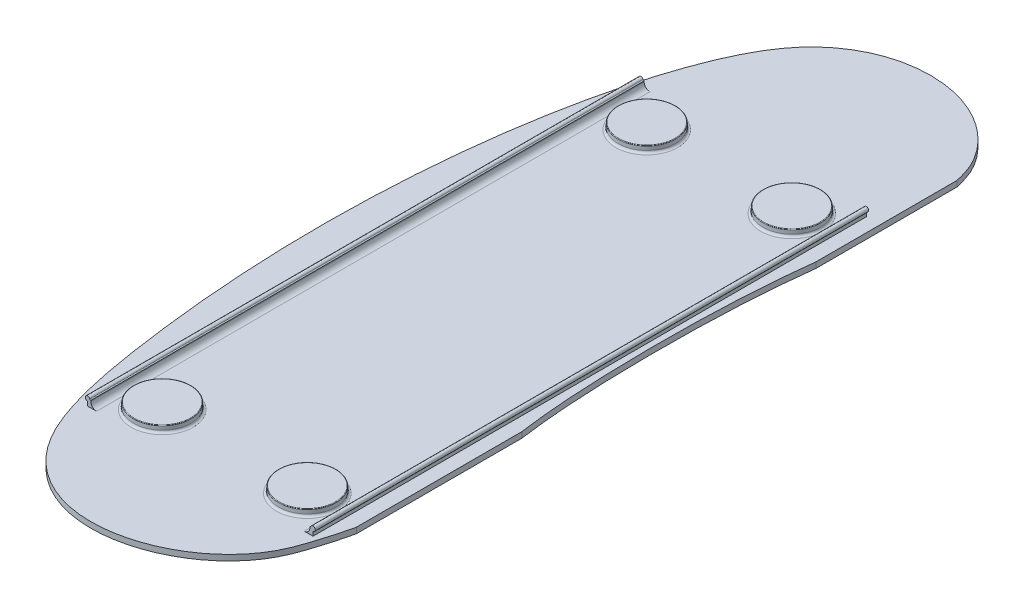
ISO-10303-21;
HEADER;
FILE_DESCRIPTION(('STEP AP214'),'2;1');
FILE_NAME('part.step','',(''),(''),'','','');
FILE_SCHEMA(('AUTOMOTIVE_DESIGN { 1 0 10303 214 1 1 1 1 }'));
ENDSEC;
DATA;
#1=APPLICATION_CONTEXT('core data for automotive mechanical design processes');
#2=APPLICATION_PROTOCOL_DEFINITION('international standard','automotive_design',2000,#1);
#3=PRODUCT_CONTEXT('',#1,'mechanical');
#4=PRODUCT('Part','Part','',(#3));
#5=PRODUCT_RELATED_PRODUCT_CATEGORY('part','',(#4));
#6=PRODUCT_DEFINITION_FORMATION('','',#4);
#7=PRODUCT_DEFINITION_CONTEXT('part definition',#1,'design');
#8=PRODUCT_DEFINITION('design','',#6,#7);
#9=PRODUCT_DEFINITION_SHAPE('','',#8);
#10=(LENGTH_UNIT() NAMED_UNIT(*) SI_UNIT(.MILLI.,.METRE.));
#11=(NAMED_UNIT(*) PLANE_ANGLE_UNIT() SI_UNIT($,.RADIAN.));
#12=(NAMED_UNIT(*) SI_UNIT($,.STERADIAN.) SOLID_ANGLE_UNIT());
#13=UNCERTAINTY_MEASURE_WITH_UNIT(LENGTH_MEASURE(1.E-05),#10,'distance_accuracy_value','');
#14=(GEOMETRIC_REPRESENTATION_CONTEXT(3) GLOBAL_UNCERTAINTY_ASSIGNED_CONTEXT((#13)) GLOBAL_UNIT_ASSIGNED_CONTEXT((#10,
#11,#12)) REPRESENTATION_CONTEXT('',''));
#15=CARTESIAN_POINT('',(0.,0.,0.));
#16=DIRECTION('',(0.,0.,1.));
#17=DIRECTION('',(1.,0.,0.));
#18=AXIS2_PLACEMENT_3D('',#15,#16,#17);
#19=CARTESIAN_POINT('',(-192.253506798672,1.15,-20.0821070412094));
#20=DIRECTION('',(1.,0.,0.));
#21=DIRECTION('',(0.,0.,-1.));
#22=AXIS2_PLACEMENT_3D('',#19,#20,#21);
#23=PLANE('',#22);
#24=DIRECTION('',(0.,-1.,0.));
#25=VECTOR('',#24,1.);
#26=CARTESIAN_POINT('',(-192.253506798672,1.15,76.4178929587906));
#27=LINE('',#26,#25);
#28=CARTESIAN_POINT('',(-192.253506798672,0.584314575050781,76.4178929587906));
#29=VERTEX_POINT('',#28);
#30=CARTESIAN_POINT('',(-192.253506798672,0.,76.4178929587906));
#31=VERTEX_POINT('',#30);
#32=EDGE_CURVE('E292',#29,#31,#27,.T.);
#33=ORIENTED_EDGE('',*,*,#32,.F.);
#34=DIRECTION('',(0.,0.,-1.));
#35=VECTOR('',#34,1.);
#36=CARTESIAN_POINT('',(-192.253506798672,0.584314575050781,-20.0821070412094));
#37=LINE('',#36,#35);
#38=CARTESIAN_POINT('',(-192.253506798672,0.584314575050781,-20.0821070412094));
#39=VERTEX_POINT('',#38);
#40=EDGE_CURVE('E435',#29,#39,#37,.T.);
#41=ORIENTED_EDGE('',*,*,#40,.T.);
#42=DIRECTION('',(0.,-1.,0.));
#43=VECTOR('',#42,1.);
#44=CARTESIAN_POINT('',(-192.253506798672,1.15,-20.0821070412094));
#45=LINE('',#44,#43);
#46=CARTESIAN_POINT('',(-192.253506798672,0.,-20.0821070412094));
#47=VERTEX_POINT('',#46);
#48=EDGE_CURVE('E294',#39,#47,#45,.T.);
#49=ORIENTED_EDGE('',*,*,#48,.T.);
#50=DIRECTION('',(0.,0.,1.));
#51=VECTOR('',#50,1.);
#52=CARTESIAN_POINT('',(-192.253506798672,0.,-20.0821070412094));
#53=LINE('',#52,#51);
#54=EDGE_CURVE('E279',#47,#31,#53,.T.);
#55=ORIENTED_EDGE('',*,*,#54,.T.);
#56=EDGE_LOOP('',(#33,#41,#49,#55));
#57=FACE_BOUND('',#56,.T.);
#58=ADVANCED_FACE('F117',(#57),#23,.F.);
#59=CARTESIAN_POINT('',(-152.953506798672,1.15,-20.0821070412094));
#60=DIRECTION('',(-1.,0.,0.));
#61=DIRECTION('',(0.,0.,1.));
#62=AXIS2_PLACEMENT_3D('',#59,#60,#61);
#63=PLANE('',#62);
#64=DIRECTION('',(0.,-1.,0.));
#65=VECTOR('',#64,1.);
#66=CARTESIAN_POINT('',(-152.953506798672,1.15,-20.0821070412094));
#67=LINE('',#66,#65);
#68=CARTESIAN_POINT('',(-152.953506798672,0.584314575050752,-20.0821070412094));
#69=VERTEX_POINT('',#68);
#70=CARTESIAN_POINT('',(-152.953506798672,0.,-20.0821070412094));
#71=VERTEX_POINT('',#70);
#72=EDGE_CURVE('E288',#69,#71,#67,.T.);
#73=ORIENTED_EDGE('',*,*,#72,.F.);
#74=DIRECTION('',(0.,0.,1.));
#75=VECTOR('',#74,1.);
#76=CARTESIAN_POINT('',(-152.953506798672,0.584314575050752,76.4178929587906));
#77=LINE('',#76,#75);
#78=CARTESIAN_POINT('',(-152.953506798672,0.584314575050752,76.4178929587906));
#79=VERTEX_POINT('',#78);
#80=EDGE_CURVE('E428',#69,#79,#77,.T.);
#81=ORIENTED_EDGE('',*,*,#80,.T.);
#82=DIRECTION('',(0.,-1.,0.));
#83=VECTOR('',#82,1.);
#84=CARTESIAN_POINT('',(-152.953506798672,1.15,76.4178929587906));
#85=LINE('',#84,#83);
#86=CARTESIAN_POINT('',(-152.953506798672,0.,76.4178929587906));
#87=VERTEX_POINT('',#86);
#88=EDGE_CURVE('E290',#79,#87,#85,.T.);
#89=ORIENTED_EDGE('',*,*,#88,.T.);
#90=DIRECTION('',(0.,0.,-1.));
#91=VECTOR('',#90,1.);
#92=CARTESIAN_POINT('',(-152.953506798672,0.,-20.0821070412094));
#93=LINE('',#92,#91);
#94=EDGE_CURVE('E285',#87,#71,#93,.T.);
#95=ORIENTED_EDGE('',*,*,#94,.T.);
#96=EDGE_LOOP('',(#73,#81,#89,#95));
#97=FACE_BOUND('',#96,.T.);
#98=ADVANCED_FACE('F386',(#97),#63,.F.);
#99=CARTESIAN_POINT('',(-152.953506798672,1.15,-20.0821070412094));
#100=DIRECTION('',(0.,0.,1.));
#101=DIRECTION('',(1.,0.,0.));
#102=AXIS2_PLACEMENT_3D('',#99,#100,#101);
#103=PLANE('',#102);
#104=DIRECTION('',(-1.,0.,0.));
#105=VECTOR('',#104,1.);
#106=CARTESIAN_POINT('',(-152.953506798672,0.,-20.0821070412094));
#107=LINE('',#106,#105);
#108=CARTESIAN_POINT('',(-154.503506798672,0.,-20.0821070412094));
#109=VERTEX_POINT('',#108);
#110=EDGE_CURVE('E277',#71,#109,#107,.T.);
#111=ORIENTED_EDGE('',*,*,#110,.T.);
#112=CARTESIAN_POINT('',(-154.503506798672,1.,-20.0821070412094));
#113=DIRECTION('',(0.,0.,1.));
#114=DIRECTION('',(1.,0.,0.));
#115=AXIS2_PLACEMENT_3D('',#112,#113,#114);
#116=CIRCLE('',#115,1.);
#117=CARTESIAN_POINT('',(-153.503506798672,1.,-20.0821070412094));
#118=VERTEX_POINT('',#117);
#119=EDGE_CURVE('E511',#109,#118,#116,.T.);
#120=ORIENTED_EDGE('',*,*,#119,.T.);
#121=DIRECTION('',(0.,1.,0.));
#122=VECTOR('',#121,1.);
#123=CARTESIAN_POINT('',(-153.503506798672,-103.785789007937,-20.0821070412094));
#124=LINE('',#123,#122);
#125=CARTESIAN_POINT('',(-153.503506798672,1.15,-20.0821070412094));
#126=VERTEX_POINT('',#125);
#127=EDGE_CURVE('E271',#118,#126,#124,.T.);
#128=ORIENTED_EDGE('',*,*,#127,.T.);
#129=CARTESIAN_POINT('',(-153.519415889582,1.349366247962,-20.0821070412094));
#130=DIRECTION('',(0.,0.,1.));
#131=DIRECTION('',(1.,0.,0.));
#132=AXIS2_PLACEMENT_3D('',#129,#130,#131);
#133=CIRCLE('',#132,0.2);
#134=CARTESIAN_POINT('',(-153.330779525945,1.28291083197464,-20.0821070412094));
#135=VERTEX_POINT('',#134);
#136=EDGE_CURVE('E441',#126,#135,#133,.T.);
#137=ORIENTED_EDGE('',*,*,#136,.T.);
#138=CARTESIAN_POINT('',(-152.953506798672,1.15,-20.0821070412094));
#139=DIRECTION('',(0.,0.,-1.));
#140=DIRECTION('',(-1.,0.,0.));
#141=AXIS2_PLACEMENT_3D('',#138,#139,#140);
#142=CIRCLE('',#141,0.400000000000011);
#143=CARTESIAN_POINT('',(-152.820173465339,0.772876383367158,-20.0821070412094));
#144=VERTEX_POINT('',#143);
#145=EDGE_CURVE('E262',#135,#144,#142,.T.);
#146=ORIENTED_EDGE('',*,*,#145,.T.);
#147=CARTESIAN_POINT('',(-152.753506798672,0.584314575050752,-20.0821070412094));
#148=DIRECTION('',(0.,0.,1.));
#149=DIRECTION('',(1.,0.,0.));
#150=AXIS2_PLACEMENT_3D('',#147,#148,#149);
#151=CIRCLE('',#150,0.2);
#152=EDGE_CURVE('E437',#144,#69,#151,.T.);
#153=ORIENTED_EDGE('',*,*,#152,.T.);
#154=ORIENTED_EDGE('',*,*,#72,.T.);
#155=EDGE_LOOP('',(#111,#120,#128,#137,#146,#153,#154));
#156=FACE_BOUND('',#155,.T.);
#157=ADVANCED_FACE('F393',(#156),#103,.F.);
#158=CARTESIAN_POINT('',(-192.253506798672,1.15,76.4178929587906));
#159=DIRECTION('',(0.,0.,-1.));
#160=DIRECTION('',(-1.,0.,0.));
#161=AXIS2_PLACEMENT_3D('',#158,#159,#160);
#162=PLANE('',#161);
#163=CARTESIAN_POINT('',(-152.953506798672,1.15,76.4178929587906));
#164=DIRECTION('',(0.,0.,-1.));
#165=DIRECTION('',(-1.,0.,0.));
#166=AXIS2_PLACEMENT_3D('',#163,#164,#165);
#167=CIRCLE('',#166,0.400000000000011);
#168=CARTESIAN_POINT('',(-153.330779525945,1.28291083197465,76.4178929587906));
#169=VERTEX_POINT('',#168);
#170=CARTESIAN_POINT('',(-152.820173465339,0.772876383367167,76.4178929587906));
#171=VERTEX_POINT('',#170);
#172=EDGE_CURVE('E267',#169,#171,#167,.T.);
#173=ORIENTED_EDGE('',*,*,#172,.F.);
#174=CARTESIAN_POINT('',(-153.519415889582,1.349366247962,76.4178929587906));
#175=DIRECTION('',(0.,0.,-1.));
#176=DIRECTION('',(-1.,0.,0.));
#177=AXIS2_PLACEMENT_3D('',#174,#175,#176);
#178=CIRCLE('',#177,0.2);
#179=CARTESIAN_POINT('',(-153.503506798672,1.15,76.4178929587906));
#180=VERTEX_POINT('',#179);
#181=EDGE_CURVE('E443',#169,#180,#178,.T.);
#182=ORIENTED_EDGE('',*,*,#181,.T.);
#183=DIRECTION('',(0.,1.,0.));
#184=VECTOR('',#183,1.);
#185=CARTESIAN_POINT('',(-153.503506798672,-103.785789007937,76.4178929587906));
#186=LINE('',#185,#184);
#187=CARTESIAN_POINT('',(-153.503506798672,1.,76.4178929587906));
#188=VERTEX_POINT('',#187);
#189=EDGE_CURVE('E274',#188,#180,#186,.T.);
#190=ORIENTED_EDGE('',*,*,#189,.F.);
#191=CARTESIAN_POINT('',(-154.503506798672,1.,76.4178929587906));
#192=DIRECTION('',(0.,0.,-1.));
#193=DIRECTION('',(-1.,0.,0.));
#194=AXIS2_PLACEMENT_3D('',#191,#192,#193);
#195=CIRCLE('',#194,1.);
#196=CARTESIAN_POINT('',(-154.503506798672,0.,76.4178929587906));
#197=VERTEX_POINT('',#196);
#198=EDGE_CURVE('E508',#188,#197,#195,.T.);
#199=ORIENTED_EDGE('',*,*,#198,.T.);
#200=DIRECTION('',(1.,0.,0.));
#201=VECTOR('',#200,1.);
#202=CARTESIAN_POINT('',(-192.253506798672,0.,76.4178929587906));
#203=LINE('',#202,#201);
#204=EDGE_CURVE('E282',#197,#87,#203,.T.);
#205=ORIENTED_EDGE('',*,*,#204,.T.);
#206=ORIENTED_EDGE('',*,*,#88,.F.);
#207=CARTESIAN_POINT('',(-152.753506798672,0.584314575050752,76.4178929587906));
#208=DIRECTION('',(0.,0.,-1.));
#209=DIRECTION('',(-1.,0.,0.));
#210=AXIS2_PLACEMENT_3D('',#207,#208,#209);
#211=CIRCLE('',#210,0.2);
#212=EDGE_CURVE('E439',#79,#171,#211,.T.);
#213=ORIENTED_EDGE('',*,*,#212,.T.);
#214=EDGE_LOOP('',(#173,#182,#190,#199,#205,#206,#213));
#215=FACE_BOUND('',#214,.T.);
#216=ADVANCED_FACE('F525',(#215),#162,.F.);
#217=CARTESIAN_POINT('',(0.,0.,0.));
#218=DIRECTION('',(0.,-1.,0.));
#219=DIRECTION('',(0.,0.,-1.));
#220=AXIS2_PLACEMENT_3D('',#217,#218,#219);
#221=PLANE('',#220);
#222=CARTESIAN_POINT('',(-185.253506798672,0.,70.4178929587906));
#223=DIRECTION('',(0.,-1.,0.));
#224=DIRECTION('',(0.,0.,-1.));
#225=AXIS2_PLACEMENT_3D('',#222,#223,#224);
#226=CIRCLE('',#225,5.39999999999999);
#227=CARTESIAN_POINT('',(-185.253506798672,0.,65.0178929587907));
#228=VERTEX_POINT('',#227);
#229=EDGE_CURVE('E483',#228,#228,#226,.T.);
#230=ORIENTED_EDGE('',*,*,#229,.T.);
#231=EDGE_LOOP('',(#230));
#232=FACE_BOUND('',#231,.T.);
#233=CARTESIAN_POINT('',(-159.953506798672,0.,70.4178929587906));
#234=DIRECTION('',(0.,-1.,0.));
#235=DIRECTION('',(0.,0.,-1.));
#236=AXIS2_PLACEMENT_3D('',#233,#234,#235);
#237=CIRCLE('',#236,5.39999999999999);
#238=CARTESIAN_POINT('',(-159.953506798672,0.,65.0178929587906));
#239=VERTEX_POINT('',#238);
#240=EDGE_CURVE('E480',#239,#239,#237,.T.);
#241=ORIENTED_EDGE('',*,*,#240,.T.);
#242=EDGE_LOOP('',(#241));
#243=FACE_BOUND('',#242,.T.);
#244=CARTESIAN_POINT('',(-185.253506798672,0.,-14.0821070412094));
#245=DIRECTION('',(0.,-1.,0.));
#246=DIRECTION('',(0.,0.,-1.));
#247=AXIS2_PLACEMENT_3D('',#244,#245,#246);
#248=CIRCLE('',#247,5.39999999999999);
#249=CARTESIAN_POINT('',(-185.253506798672,0.,-19.4821070412094));
#250=VERTEX_POINT('',#249);
#251=EDGE_CURVE('E477',#250,#250,#248,.T.);
#252=ORIENTED_EDGE('',*,*,#251,.T.);
#253=EDGE_LOOP('',(#252));
#254=FACE_BOUND('',#253,.T.);
#255=CARTESIAN_POINT('',(-159.953506798672,0.,-14.0821070412094));
#256=DIRECTION('',(0.,-1.,0.));
#257=DIRECTION('',(0.,0.,-1.));
#258=AXIS2_PLACEMENT_3D('',#255,#256,#257);
#259=CIRCLE('',#258,5.39999999999999);
#260=CARTESIAN_POINT('',(-159.953506798672,0.,-19.4821070412094));
#261=VERTEX_POINT('',#260);
#262=EDGE_CURVE('E474',#261,#261,#259,.T.);
#263=ORIENTED_EDGE('',*,*,#262,.T.);
#264=EDGE_LOOP('',(#263));
#265=FACE_BOUND('',#264,.T.);
#266=DIRECTION('',(0.,0.,1.));
#267=VECTOR('',#266,1.);
#268=CARTESIAN_POINT('',(-190.703506798672,0.,76.4178929587906));
#269=LINE('',#268,#267);
#270=CARTESIAN_POINT('',(-190.703506798672,0.,-20.0821070412094));
#271=VERTEX_POINT('',#270);
#272=CARTESIAN_POINT('',(-190.703506798672,0.,76.4178929587906));
#273=VERTEX_POINT('',#272);
#274=EDGE_CURVE('E501',#271,#273,#269,.T.);
#275=ORIENTED_EDGE('',*,*,#274,.T.);
#276=EDGE_CURVE('E283',#31,#273,#203,.T.);
#277=ORIENTED_EDGE('',*,*,#276,.F.);
#278=ORIENTED_EDGE('',*,*,#54,.F.);
#279=EDGE_CURVE('E273',#271,#47,#107,.T.);
#280=ORIENTED_EDGE('',*,*,#279,.F.);
#281=EDGE_LOOP('',(#275,#277,#278,#280));
#282=FACE_BOUND('',#281,.T.);
#283=DIRECTION('',(0.,0.,1.));
#284=VECTOR('',#283,1.);
#285=CARTESIAN_POINT('',(-150.543506798672,0.,0.));
#286=LINE('',#285,#284);
#287=CARTESIAN_POINT('',(-150.543506798672,0.,42.4221344366589));
#288=VERTEX_POINT('',#287);
#289=CARTESIAN_POINT('',(-150.543506798672,0.,71.2812308740238));
#290=VERTEX_POINT('',#289);
#291=EDGE_CURVE('E296',#288,#290,#286,.T.);
#292=ORIENTED_EDGE('',*,*,#291,.F.);
#293=CARTESIAN_POINT('',(-150.543506798672,0.,42.4221344366589));
#294=CARTESIAN_POINT('',(-149.87356577608,0.,48.1140128894975));
#295=CARTESIAN_POINT('',(-148.278546710452,0.,63.9626210010931));
#296=CARTESIAN_POINT('',(-151.853536774706,0.,76.2414544995898));
#297=CARTESIAN_POINT('',(-157.159821335867,0.,93.1301695319022));
#298=CARTESIAN_POINT('',(-189.449961988125,0.,102.027699126461));
#299=CARTESIAN_POINT('',(-203.492044916193,0.,30.0657144599285));
#300=CARTESIAN_POINT('',(-196.078968692878,0.,-21.8132718738506));
#301=CARTESIAN_POINT('',(-179.12954818703,0.,-49.342726570093));
#302=CARTESIAN_POINT('',(-159.828165808346,0.,-48.9223362720737));
#303=CARTESIAN_POINT('',(-151.707122140152,0.,-37.5608181876024));
#304=CARTESIAN_POINT('',(-150.628141150404,0.,-34.0922077096906));
#305=CARTESIAN_POINT('',(-149.005776309877,0.,-25.5043753827882));
#306=CARTESIAN_POINT('',(-149.753495962378,0.,-15.3590020513309));
#307=CARTESIAN_POINT('',(-152.504186571276,0.,7.27371901696906));
#308=CARTESIAN_POINT('',(-151.994040872551,0.,31.6859631096172));
#309=CARTESIAN_POINT('',(-150.744518549863,0.,40.7143207384556));
#310=CARTESIAN_POINT('',(-150.543506798672,0.,42.4221344366589));
#311=B_SPLINE_CURVE_WITH_KNOTS('',3,(#293,#294,#295,#296,#297,#298,#299,#300,#301,#302,#303,
#304,#305,#306,#307,#308,#309,#310),.UNSPECIFIED.,.T.,.F.,(4,1,1,1,1,1,1,1,1,1,1,1,1,1,1,4),(0.,
0.077011586370835,0.0902811537206076,0.105290010403906,0.213565692892721,0.249846177996582,
0.43181437633865,0.473017713532991,0.620676212745646,0.641064732595728,0.656514392183728,
0.669494179040439,0.757882814306125,0.792038254342903,0.976893139371433,0.999999999999999),.UNSPECIFIED.);
#312=CARTESIAN_POINT('',(-150.543506798672,0.,-8.92432629280241));
#313=VERTEX_POINT('',#312);
#314=EDGE_CURVE('E301',#313,#288,#311,.T.);
#315=ORIENTED_EDGE('',*,*,#314,.F.);
#316=DIRECTION('',(0.,0.,-1.));
#317=VECTOR('',#316,1.);
#318=CARTESIAN_POINT('',(-150.543506798672,0.,0.));
#319=LINE('',#318,#317);
#320=CARTESIAN_POINT('',(-150.543506798672,0.,-33.4757120400574));
#321=VERTEX_POINT('',#320);
#322=EDGE_CURVE('E559',#313,#321,#319,.T.);
#323=ORIENTED_EDGE('',*,*,#322,.T.);
#324=EDGE_CURVE('E558',#290,#321,#311,.T.);
#325=ORIENTED_EDGE('',*,*,#324,.F.);
#326=EDGE_LOOP('',(#292,#315,#323,#325));
#327=FACE_BOUND('',#326,.T.);
#328=ORIENTED_EDGE('',*,*,#204,.F.);
#329=DIRECTION('',(0.,0.,1.));
#330=VECTOR('',#329,1.);
#331=CARTESIAN_POINT('',(-154.503506798672,0.,0.));
#332=LINE('',#331,#330);
#333=EDGE_CURVE('E504',#197,#109,#332,.F.);
#334=ORIENTED_EDGE('',*,*,#333,.T.);
#335=ORIENTED_EDGE('',*,*,#110,.F.);
#336=ORIENTED_EDGE('',*,*,#94,.F.);
#337=EDGE_LOOP('',(#328,#334,#335,#336));
#338=FACE_BOUND('',#337,.T.);
#339=ADVANCED_FACE('F321',(#232,#243,#254,#265,#282,#327,#338),#221,.F.);
#340=CARTESIAN_POINT('',(-150.543506798672,-1.,0.));
#341=DIRECTION('',(-1.,0.,0.));
#342=DIRECTION('',(0.,0.,1.));
#343=AXIS2_PLACEMENT_3D('',#340,#341,#342);
#344=PLANE('',#343);
#345=ORIENTED_EDGE('',*,*,#291,.T.);
#346=DIRECTION('',(0.,1.,0.));
#347=VECTOR('',#346,1.);
#348=CARTESIAN_POINT('',(-150.543506798672,-1.,71.2812308740238));
#349=LINE('',#348,#347);
#350=CARTESIAN_POINT('',(-150.543506798672,-1.,71.2812308740238));
#351=VERTEX_POINT('',#350);
#352=EDGE_CURVE('E413',#351,#290,#349,.T.);
#353=ORIENTED_EDGE('',*,*,#352,.F.);
#354=DIRECTION('',(0.,0.,1.));
#355=VECTOR('',#354,1.);
#356=CARTESIAN_POINT('',(-150.543506798672,-1.,0.));
#357=LINE('',#356,#355);
#358=CARTESIAN_POINT('',(-150.543506798672,-1.,42.4221344366589));
#359=VERTEX_POINT('',#358);
#360=EDGE_CURVE('E297',#359,#351,#357,.T.);
#361=ORIENTED_EDGE('',*,*,#360,.F.);
#362=DIRECTION('',(0.,1.,0.));
#363=VECTOR('',#362,1.);
#364=CARTESIAN_POINT('',(-150.543506798672,-1.,42.4221344366589));
#365=LINE('',#364,#363);
#366=EDGE_CURVE('E568',#359,#288,#365,.T.);
#367=ORIENTED_EDGE('',*,*,#366,.T.);
#368=EDGE_LOOP('',(#345,#353,#361,#367));
#369=FACE_BOUND('',#368,.T.);
#370=ADVANCED_FACE('F326',(#369),#344,.F.);
#371=CARTESIAN_POINT('',(-150.543506798672,-1.,42.4221344366589));
#372=CARTESIAN_POINT('',(-149.87356577608,-1.,48.1140128894975));
#373=CARTESIAN_POINT('',(-148.278546710452,-1.,63.9626210010931));
#374=CARTESIAN_POINT('',(-151.853536774706,-1.,76.2414544995898));
#375=CARTESIAN_POINT('',(-157.159821335867,-1.,93.1301695319022));
#376=CARTESIAN_POINT('',(-189.449961988125,-1.,102.027699126461));
#377=CARTESIAN_POINT('',(-203.492044916193,-1.,30.0657144599285));
#378=CARTESIAN_POINT('',(-196.078968692878,-1.,-21.8132718738506));
#379=CARTESIAN_POINT('',(-179.12954818703,-1.,-49.342726570093));
#380=CARTESIAN_POINT('',(-159.828165808346,-1.,-48.9223362720737));
#381=CARTESIAN_POINT('',(-151.707122140152,-1.,-37.5608181876024));
#382=CARTESIAN_POINT('',(-150.628141150404,-1.,-34.0922077096906));
#383=CARTESIAN_POINT('',(-149.005776309877,-1.,-25.5043753827882));
#384=CARTESIAN_POINT('',(-149.753495962378,-1.,-15.3590020513309));
#385=CARTESIAN_POINT('',(-152.504186571276,-1.,7.27371901696906));
#386=CARTESIAN_POINT('',(-151.994040872551,-1.,31.6859631096172));
#387=CARTESIAN_POINT('',(-150.744518549863,-1.,40.7143207384556));
#388=CARTESIAN_POINT('',(-150.543506798672,-1.,42.4221344366589));
#389=B_SPLINE_CURVE_WITH_KNOTS('',3,(#371,#372,#373,#374,#375,#376,#377,#378,#379,#380,#381,
#382,#383,#384,#385,#386,#387,#388),.UNSPECIFIED.,.T.,.F.,(4,1,1,1,1,1,1,1,1,1,1,1,1,1,1,4),(0.,
0.077011586370835,0.0902811537206076,0.105290010403906,0.213565692892721,0.249846177996582,
0.43181437633865,0.473017713532991,0.620676212745646,0.641064732595728,0.656514392183728,
0.669494179040439,0.757882814306125,0.792038254342903,0.976893139371433,0.999999999999999),.UNSPECIFIED.);
#390=DIRECTION('',(0.,1.,0.));
#391=VECTOR('',#390,1.);
#392=SURFACE_OF_LINEAR_EXTRUSION('',#389,#391);
#393=ORIENTED_EDGE('',*,*,#324,.T.);
#394=DIRECTION('',(0.,1.,0.));
#395=VECTOR('',#394,1.);
#396=CARTESIAN_POINT('',(-150.543506798672,-1.,-33.4757120400574));
#397=LINE('',#396,#395);
#398=CARTESIAN_POINT('',(-150.543506798672,-1.,-33.4757120400574));
#399=VERTEX_POINT('',#398);
#400=EDGE_CURVE('E418',#399,#321,#397,.T.);
#401=ORIENTED_EDGE('',*,*,#400,.F.);
#402=EDGE_CURVE('E300',#351,#399,#389,.T.);
#403=ORIENTED_EDGE('',*,*,#402,.F.);
#404=ORIENTED_EDGE('',*,*,#352,.T.);
#405=EDGE_LOOP('',(#393,#401,#403,#404));
#406=FACE_BOUND('',#405,.T.);
#407=ADVANCED_FACE('F320',(#406),#392,.F.);
#408=CARTESIAN_POINT('',(-150.543506798672,-1.,0.));
#409=DIRECTION('',(1.,0.,0.));
#410=DIRECTION('',(0.,0.,-1.));
#411=AXIS2_PLACEMENT_3D('',#408,#409,#410);
#412=PLANE('',#411);
#413=ORIENTED_EDGE('',*,*,#322,.F.);
#414=DIRECTION('',(0.,1.,0.));
#415=VECTOR('',#414,1.);
#416=CARTESIAN_POINT('',(-150.543506798672,-1.,-8.92432629280241));
#417=LINE('',#416,#415);
#418=CARTESIAN_POINT('',(-150.543506798672,-1.,-8.92432629280241));
#419=VERTEX_POINT('',#418);
#420=EDGE_CURVE('E422',#419,#313,#417,.T.);
#421=ORIENTED_EDGE('',*,*,#420,.F.);
#422=DIRECTION('',(0.,0.,-1.));
#423=VECTOR('',#422,1.);
#424=CARTESIAN_POINT('',(-150.543506798672,-1.,0.));
#425=LINE('',#424,#423);
#426=EDGE_CURVE('E306',#419,#399,#425,.T.);
#427=ORIENTED_EDGE('',*,*,#426,.T.);
#428=ORIENTED_EDGE('',*,*,#400,.T.);
#429=EDGE_LOOP('',(#413,#421,#427,#428));
#430=FACE_BOUND('',#429,.T.);
#431=ADVANCED_FACE('F318',(#430),#412,.T.);
#432=ORIENTED_EDGE('',*,*,#314,.T.);
#433=ORIENTED_EDGE('',*,*,#366,.F.);
#434=EDGE_CURVE('E307',#419,#359,#389,.T.);
#435=ORIENTED_EDGE('',*,*,#434,.F.);
#436=ORIENTED_EDGE('',*,*,#420,.T.);
#437=EDGE_LOOP('',(#432,#433,#435,#436));
#438=FACE_BOUND('',#437,.T.);
#439=ADVANCED_FACE('F313',(#438),#392,.F.);
#440=CARTESIAN_POINT('',(0.,-1.,0.));
#441=DIRECTION('',(0.,-1.,0.));
#442=DIRECTION('',(0.,0.,-1.));
#443=AXIS2_PLACEMENT_3D('',#440,#441,#442);
#444=PLANE('',#443);
#445=ORIENTED_EDGE('',*,*,#360,.T.);
#446=ORIENTED_EDGE('',*,*,#402,.T.);
#447=ORIENTED_EDGE('',*,*,#426,.F.);
#448=ORIENTED_EDGE('',*,*,#434,.T.);
#449=EDGE_LOOP('',(#445,#446,#447,#448));
#450=FACE_BOUND('',#449,.T.);
#451=ADVANCED_FACE('F317',(#450),#444,.T.);
#452=CARTESIAN_POINT('',(-192.253506798672,1.15,-20.0821070412094));
#453=DIRECTION('',(0.,0.,1.));
#454=DIRECTION('',(1.,0.,0.));
#455=AXIS2_PLACEMENT_3D('',#452,#453,#454);
#456=CIRCLE('',#455,0.399999999999984);
#457=CARTESIAN_POINT('',(-191.8762340714,1.28291083197468,-20.0821070412094));
#458=VERTEX_POINT('',#457);
#459=CARTESIAN_POINT('',(-192.386840132006,0.772876383367197,-20.0821070412094));
#460=VERTEX_POINT('',#459);
#461=EDGE_CURVE('E254',#458,#460,#456,.T.);
#462=ORIENTED_EDGE('',*,*,#461,.F.);
#463=CARTESIAN_POINT('',(-191.687597707763,1.349366247962,-20.0821070412094));
#464=DIRECTION('',(0.,0.,1.));
#465=DIRECTION('',(1.,0.,0.));
#466=AXIS2_PLACEMENT_3D('',#463,#464,#465);
#467=CIRCLE('',#466,0.2);
#468=CARTESIAN_POINT('',(-191.703506798672,1.15,-20.0821070412094));
#469=VERTEX_POINT('',#468);
#470=EDGE_CURVE('E251',#458,#469,#467,.T.);
#471=ORIENTED_EDGE('',*,*,#470,.T.);
#472=DIRECTION('',(0.,1.,0.));
#473=VECTOR('',#472,1.);
#474=CARTESIAN_POINT('',(-191.703506798672,-103.785789007937,-20.0821070412094));
#475=LINE('',#474,#473);
#476=CARTESIAN_POINT('',(-191.703506798672,1.,-20.0821070412094));
#477=VERTEX_POINT('',#476);
#478=EDGE_CURVE('E239',#477,#469,#475,.T.);
#479=ORIENTED_EDGE('',*,*,#478,.F.);
#480=CARTESIAN_POINT('',(-190.703506798672,1.,-20.0821070412094));
#481=DIRECTION('',(0.,0.,1.));
#482=DIRECTION('',(1.,0.,0.));
#483=AXIS2_PLACEMENT_3D('',#480,#481,#482);
#484=CIRCLE('',#483,1.);
#485=EDGE_CURVE('E12',#477,#271,#484,.T.);
#486=ORIENTED_EDGE('',*,*,#485,.T.);
#487=ORIENTED_EDGE('',*,*,#279,.T.);
#488=ORIENTED_EDGE('',*,*,#48,.F.);
#489=CARTESIAN_POINT('',(-192.453506798672,0.584314575050781,-20.0821070412094));
#490=DIRECTION('',(0.,0.,1.));
#491=DIRECTION('',(1.,0.,0.));
#492=AXIS2_PLACEMENT_3D('',#489,#490,#491);
#493=CIRCLE('',#492,0.2);
#494=EDGE_CURVE('E448',#39,#460,#493,.T.);
#495=ORIENTED_EDGE('',*,*,#494,.T.);
#496=EDGE_LOOP('',(#462,#471,#479,#486,#487,#488,#495));
#497=FACE_BOUND('',#496,.T.);
#498=ADVANCED_FACE('F252',(#497),#103,.F.);
#499=ORIENTED_EDGE('',*,*,#276,.T.);
#500=CARTESIAN_POINT('',(-190.703506798672,1.,76.4178929587906));
#501=DIRECTION('',(0.,0.,-1.));
#502=DIRECTION('',(-1.,0.,0.));
#503=AXIS2_PLACEMENT_3D('',#500,#501,#502);
#504=CIRCLE('',#503,1.);
#505=CARTESIAN_POINT('',(-191.703506798672,1.,76.4178929587906));
#506=VERTEX_POINT('',#505);
#507=EDGE_CURVE('E125',#273,#506,#504,.T.);
#508=ORIENTED_EDGE('',*,*,#507,.T.);
#509=DIRECTION('',(0.,1.,0.));
#510=VECTOR('',#509,1.);
#511=CARTESIAN_POINT('',(-191.703506798672,-103.785789007937,76.4178929587906));
#512=LINE('',#511,#510);
#513=CARTESIAN_POINT('',(-191.703506798672,1.15,76.4178929587906));
#514=VERTEX_POINT('',#513);
#515=EDGE_CURVE('E246',#506,#514,#512,.T.);
#516=ORIENTED_EDGE('',*,*,#515,.T.);
#517=CARTESIAN_POINT('',(-191.687597707763,1.349366247962,76.4178929587906));
#518=DIRECTION('',(0.,0.,-1.));
#519=DIRECTION('',(-1.,0.,0.));
#520=AXIS2_PLACEMENT_3D('',#517,#518,#519);
#521=CIRCLE('',#520,0.2);
#522=CARTESIAN_POINT('',(-191.8762340714,1.28291083197468,76.4178929587906));
#523=VERTEX_POINT('',#522);
#524=EDGE_CURVE('E258',#514,#523,#521,.T.);
#525=ORIENTED_EDGE('',*,*,#524,.T.);
#526=CARTESIAN_POINT('',(-192.253506798672,1.15,76.4178929587906));
#527=DIRECTION('',(0.,0.,1.));
#528=DIRECTION('',(1.,0.,0.));
#529=AXIS2_PLACEMENT_3D('',#526,#527,#528);
#530=CIRCLE('',#529,0.399999999999984);
#531=CARTESIAN_POINT('',(-192.386840132006,0.772876383367197,76.4178929587906));
#532=VERTEX_POINT('',#531);
#533=EDGE_CURVE('E852',#523,#532,#530,.T.);
#534=ORIENTED_EDGE('',*,*,#533,.T.);
#535=CARTESIAN_POINT('',(-192.453506798672,0.584314575050781,76.4178929587906));
#536=DIRECTION('',(0.,0.,-1.));
#537=DIRECTION('',(-1.,0.,0.));
#538=AXIS2_PLACEMENT_3D('',#535,#536,#537);
#539=CIRCLE('',#538,0.2);
#540=EDGE_CURVE('E257',#532,#29,#539,.T.);
#541=ORIENTED_EDGE('',*,*,#540,.T.);
#542=ORIENTED_EDGE('',*,*,#32,.T.);
#543=EDGE_LOOP('',(#499,#508,#516,#525,#534,#541,#542));
#544=FACE_BOUND('',#543,.T.);
#545=ADVANCED_FACE('F399',(#544),#162,.F.);
#546=CARTESIAN_POINT('',(-159.953506798672,-103.785789007937,70.4178929587906));
#547=DIRECTION('',(0.,1.,0.));
#548=DIRECTION('',(0.,0.,1.));
#549=AXIS2_PLACEMENT_3D('',#546,#547,#548);
#550=CYLINDRICAL_SURFACE('',#549,4.99999999999999);
#551=CARTESIAN_POINT('',(-159.953506798672,0.399999999999998,70.4178929587906));
#552=DIRECTION('',(0.,-1.,0.));
#553=DIRECTION('',(0.,0.,-1.));
#554=AXIS2_PLACEMENT_3D('',#551,#552,#553);
#555=CIRCLE('',#554,4.99999999999999);
#556=CARTESIAN_POINT('',(-159.953506798672,0.399999999999998,65.4178929587906));
#557=VERTEX_POINT('',#556);
#558=EDGE_CURVE('E489',#557,#557,#555,.F.);
#559=ORIENTED_EDGE('',*,*,#558,.T.);
#560=EDGE_LOOP('',(#559));
#561=FACE_BOUND('',#560,.T.);
#562=CARTESIAN_POINT('',(-159.953506798672,1.05,70.4178929587906));
#563=DIRECTION('',(0.,1.,0.));
#564=DIRECTION('',(0.,0.,1.));
#565=AXIS2_PLACEMENT_3D('',#562,#563,#564);
#566=CIRCLE('',#565,4.99999999999999);
#567=CARTESIAN_POINT('',(-159.953506798672,1.05,75.4178929587906));
#568=VERTEX_POINT('',#567);
#569=EDGE_CURVE('E465',#568,#568,#566,.F.);
#570=ORIENTED_EDGE('',*,*,#569,.T.);
#571=EDGE_LOOP('',(#570));
#572=FACE_BOUND('',#571,.T.);
#573=ADVANCED_FACE('F615',(#561,#572),#550,.T.);
#574=CARTESIAN_POINT('',(-191.703506798672,-103.785789007937,-20.0821070412094));
#575=DIRECTION('',(-1.,0.,0.));
#576=DIRECTION('',(0.,0.,1.));
#577=AXIS2_PLACEMENT_3D('',#574,#575,#576);
#578=PLANE('',#577);
#579=ORIENTED_EDGE('',*,*,#515,.F.);
#580=DIRECTION('',(0.,0.,1.));
#581=VECTOR('',#580,1.);
#582=CARTESIAN_POINT('',(-191.703506798672,1.,-20.0821070412094));
#583=LINE('',#582,#581);
#584=EDGE_CURVE('E138',#506,#477,#583,.F.);
#585=ORIENTED_EDGE('',*,*,#584,.T.);
#586=ORIENTED_EDGE('',*,*,#478,.T.);
#587=DIRECTION('',(0.,0.,1.));
#588=VECTOR('',#587,1.);
#589=CARTESIAN_POINT('',(-191.703506798672,1.15,-20.0821070412094));
#590=LINE('',#589,#588);
#591=EDGE_CURVE('E243',#469,#514,#590,.T.);
#592=ORIENTED_EDGE('',*,*,#591,.T.);
#593=EDGE_LOOP('',(#579,#585,#586,#592));
#594=FACE_BOUND('',#593,.T.);
#595=ADVANCED_FACE('F241',(#594),#578,.F.);
#596=CARTESIAN_POINT('',(-153.503506798672,-103.785789007937,-20.0821070412094));
#597=DIRECTION('',(-1.,0.,0.));
#598=DIRECTION('',(0.,0.,1.));
#599=AXIS2_PLACEMENT_3D('',#596,#597,#598);
#600=PLANE('',#599);
#601=ORIENTED_EDGE('',*,*,#127,.F.);
#602=DIRECTION('',(0.,0.,1.));
#603=VECTOR('',#602,1.);
#604=CARTESIAN_POINT('',(-153.503506798672,1.,-20.0821070412094));
#605=LINE('',#604,#603);
#606=EDGE_CURVE('E498',#118,#188,#605,.T.);
#607=ORIENTED_EDGE('',*,*,#606,.T.);
#608=ORIENTED_EDGE('',*,*,#189,.T.);
#609=DIRECTION('',(0.,0.,1.));
#610=VECTOR('',#609,1.);
#611=CARTESIAN_POINT('',(-153.503506798672,1.15,-20.0821070412094));
#612=LINE('',#611,#610);
#613=EDGE_CURVE('E247',#126,#180,#612,.T.);
#614=ORIENTED_EDGE('',*,*,#613,.F.);
#615=EDGE_LOOP('',(#601,#607,#608,#614));
#616=FACE_BOUND('',#615,.T.);
#617=ADVANCED_FACE('F520',(#616),#600,.T.);
#618=CARTESIAN_POINT('',(-185.253506798672,-103.785789007937,-14.0821070412094));
#619=DIRECTION('',(0.,1.,0.));
#620=DIRECTION('',(0.,0.,1.));
#621=AXIS2_PLACEMENT_3D('',#618,#619,#620);
#622=CYLINDRICAL_SURFACE('',#621,4.99999999999999);
#623=CARTESIAN_POINT('',(-185.253506798672,0.399999999999998,-14.0821070412094));
#624=DIRECTION('',(0.,-1.,0.));
#625=DIRECTION('',(0.,0.,-1.));
#626=AXIS2_PLACEMENT_3D('',#623,#624,#625);
#627=CIRCLE('',#626,4.99999999999999);
#628=CARTESIAN_POINT('',(-185.253506798672,0.399999999999998,-19.0821070412094));
#629=VERTEX_POINT('',#628);
#630=EDGE_CURVE('E492',#629,#629,#627,.F.);
#631=ORIENTED_EDGE('',*,*,#630,.T.);
#632=EDGE_LOOP('',(#631));
#633=FACE_BOUND('',#632,.T.);
#634=CARTESIAN_POINT('',(-185.253506798672,1.05,-14.0821070412094));
#635=DIRECTION('',(0.,1.,0.));
#636=DIRECTION('',(0.,0.,1.));
#637=AXIS2_PLACEMENT_3D('',#634,#635,#636);
#638=CIRCLE('',#637,4.99999999999999);
#639=CARTESIAN_POINT('',(-185.253506798672,1.05,-9.08210704120938));
#640=VERTEX_POINT('',#639);
#641=EDGE_CURVE('E453',#640,#640,#638,.F.);
#642=ORIENTED_EDGE('',*,*,#641,.T.);
#643=EDGE_LOOP('',(#642));
#644=FACE_BOUND('',#643,.T.);
#645=ADVANCED_FACE('F693',(#633,#644),#622,.T.);
#646=CARTESIAN_POINT('',(-159.953506798672,-103.785789007937,-14.0821070412094));
#647=DIRECTION('',(0.,1.,0.));
#648=DIRECTION('',(0.,0.,1.));
#649=AXIS2_PLACEMENT_3D('',#646,#647,#648);
#650=CYLINDRICAL_SURFACE('',#649,4.99999999999999);
#651=CARTESIAN_POINT('',(-159.953506798672,0.399999999999998,-14.0821070412094));
#652=DIRECTION('',(0.,-1.,0.));
#653=DIRECTION('',(0.,0.,-1.));
#654=AXIS2_PLACEMENT_3D('',#651,#652,#653);
#655=CIRCLE('',#654,4.99999999999999);
#656=CARTESIAN_POINT('',(-159.953506798672,0.399999999999998,-19.0821070412094));
#657=VERTEX_POINT('',#656);
#658=EDGE_CURVE('E495',#657,#657,#655,.F.);
#659=ORIENTED_EDGE('',*,*,#658,.T.);
#660=EDGE_LOOP('',(#659));
#661=FACE_BOUND('',#660,.T.);
#662=CARTESIAN_POINT('',(-159.953506798672,1.05,-14.0821070412094));
#663=DIRECTION('',(0.,1.,0.));
#664=DIRECTION('',(0.,0.,1.));
#665=AXIS2_PLACEMENT_3D('',#662,#663,#664);
#666=CIRCLE('',#665,4.99999999999999);
#667=CARTESIAN_POINT('',(-159.953506798672,1.05,-9.08210704120938));
#668=VERTEX_POINT('',#667);
#669=EDGE_CURVE('E456',#668,#668,#666,.F.);
#670=ORIENTED_EDGE('',*,*,#669,.T.);
#671=EDGE_LOOP('',(#670));
#672=FACE_BOUND('',#671,.T.);
#673=ADVANCED_FACE('F701',(#661,#672),#650,.T.);
#674=CARTESIAN_POINT('',(-185.253506798672,-103.785789007937,70.4178929587906));
#675=DIRECTION('',(0.,1.,0.));
#676=DIRECTION('',(0.,0.,1.));
#677=AXIS2_PLACEMENT_3D('',#674,#675,#676);
#678=CYLINDRICAL_SURFACE('',#677,4.99999999999999);
#679=CARTESIAN_POINT('',(-185.253506798672,0.399999999999998,70.4178929587906));
#680=DIRECTION('',(0.,-1.,0.));
#681=DIRECTION('',(0.,0.,-1.));
#682=AXIS2_PLACEMENT_3D('',#679,#680,#681);
#683=CIRCLE('',#682,4.99999999999999);
#684=CARTESIAN_POINT('',(-185.253506798672,0.399999999999998,65.4178929587906));
#685=VERTEX_POINT('',#684);
#686=EDGE_CURVE('E486',#685,#685,#683,.F.);
#687=ORIENTED_EDGE('',*,*,#686,.T.);
#688=EDGE_LOOP('',(#687));
#689=FACE_BOUND('',#688,.T.);
#690=CARTESIAN_POINT('',(-185.253506798672,1.05,70.4178929587906));
#691=DIRECTION('',(0.,1.,0.));
#692=DIRECTION('',(0.,0.,1.));
#693=AXIS2_PLACEMENT_3D('',#690,#691,#692);
#694=CIRCLE('',#693,4.99999999999999);
#695=CARTESIAN_POINT('',(-185.253506798672,1.05,75.4178929587906));
#696=VERTEX_POINT('',#695);
#697=EDGE_CURVE('E468',#696,#696,#694,.F.);
#698=ORIENTED_EDGE('',*,*,#697,.T.);
#699=EDGE_LOOP('',(#698));
#700=FACE_BOUND('',#699,.T.);
#701=ADVANCED_FACE('F646',(#689,#700),#678,.T.);
#702=CARTESIAN_POINT('',(0.,1.15,0.));
#703=DIRECTION('',(0.,1.,0.));
#704=DIRECTION('',(0.,0.,1.));
#705=AXIS2_PLACEMENT_3D('',#702,#703,#704);
#706=PLANE('',#705);
#707=CARTESIAN_POINT('',(-159.953506798672,1.15,-14.0821070412094));
#708=DIRECTION('',(0.,1.,0.));
#709=DIRECTION('',(0.,0.,1.));
#710=AXIS2_PLACEMENT_3D('',#707,#708,#709);
#711=CIRCLE('',#710,4.89999999999999);
#712=CARTESIAN_POINT('',(-159.953506798672,1.15,-9.18210704120938));
#713=VERTEX_POINT('',#712);
#714=EDGE_CURVE('E459',#713,#713,#711,.T.);
#715=ORIENTED_EDGE('',*,*,#714,.T.);
#716=EDGE_LOOP('',(#715));
#717=FACE_BOUND('',#716,.T.);
#718=ADVANCED_FACE('F627',(#717),#706,.T.);
#719=CARTESIAN_POINT('',(-185.253506798672,1.15,-14.0821070412094));
#720=DIRECTION('',(0.,1.,0.));
#721=DIRECTION('',(0.,0.,1.));
#722=AXIS2_PLACEMENT_3D('',#719,#720,#721);
#723=CIRCLE('',#722,4.89999999999999);
#724=CARTESIAN_POINT('',(-185.253506798672,1.15,-9.18210704120938));
#725=VERTEX_POINT('',#724);
#726=EDGE_CURVE('E450',#725,#725,#723,.T.);
#727=ORIENTED_EDGE('',*,*,#726,.T.);
#728=EDGE_LOOP('',(#727));
#729=FACE_BOUND('',#728,.T.);
#730=ADVANCED_FACE('F621',(#729),#706,.T.);
#731=CARTESIAN_POINT('',(-159.953506798672,1.15,70.4178929587906));
#732=DIRECTION('',(0.,1.,0.));
#733=DIRECTION('',(0.,0.,1.));
#734=AXIS2_PLACEMENT_3D('',#731,#732,#733);
#735=CIRCLE('',#734,4.89999999999999);
#736=CARTESIAN_POINT('',(-159.953506798672,1.15,75.3178929587906));
#737=VERTEX_POINT('',#736);
#738=EDGE_CURVE('E462',#737,#737,#735,.T.);
#739=ORIENTED_EDGE('',*,*,#738,.T.);
#740=EDGE_LOOP('',(#739));
#741=FACE_BOUND('',#740,.T.);
#742=ADVANCED_FACE('F626',(#741),#706,.T.);
#743=CARTESIAN_POINT('',(-185.253506798672,1.15,70.4178929587906));
#744=DIRECTION('',(0.,1.,0.));
#745=DIRECTION('',(0.,0.,1.));
#746=AXIS2_PLACEMENT_3D('',#743,#744,#745);
#747=CIRCLE('',#746,4.89999999999999);
#748=CARTESIAN_POINT('',(-185.253506798672,1.15,75.3178929587906));
#749=VERTEX_POINT('',#748);
#750=EDGE_CURVE('E471',#749,#749,#747,.T.);
#751=ORIENTED_EDGE('',*,*,#750,.T.);
#752=EDGE_LOOP('',(#751));
#753=FACE_BOUND('',#752,.T.);
#754=ADVANCED_FACE('F630',(#753),#706,.T.);
#755=CARTESIAN_POINT('',(-152.953506798672,1.15,76.4178929587906));
#756=DIRECTION('',(0.,0.,-1.));
#757=DIRECTION('',(-1.,0.,0.));
#758=AXIS2_PLACEMENT_3D('',#755,#756,#757);
#759=CYLINDRICAL_SURFACE('',#758,0.400000000000011);
#760=ORIENTED_EDGE('',*,*,#172,.T.);
#761=DIRECTION('',(0.,0.,-1.));
#762=VECTOR('',#761,1.);
#763=CARTESIAN_POINT('',(-152.820173465339,0.772876383367167,76.4178929587906));
#764=LINE('',#763,#762);
#765=EDGE_CURVE('E420',#171,#144,#764,.T.);
#766=ORIENTED_EDGE('',*,*,#765,.T.);
#767=ORIENTED_EDGE('',*,*,#145,.F.);
#768=DIRECTION('',(0.,0.,-1.));
#769=VECTOR('',#768,1.);
#770=CARTESIAN_POINT('',(-153.330779525945,1.28291083197466,76.4178929587906));
#771=LINE('',#770,#769);
#772=EDGE_CURVE('E417',#135,#169,#771,.F.);
#773=ORIENTED_EDGE('',*,*,#772,.T.);
#774=EDGE_LOOP('',(#760,#766,#767,#773));
#775=FACE_BOUND('',#774,.T.);
#776=ADVANCED_FACE('F533',(#775),#759,.T.);
#777=CARTESIAN_POINT('',(-192.253506798672,1.15,76.4178929587906));
#778=DIRECTION('',(0.,0.,1.));
#779=DIRECTION('',(1.,0.,0.));
#780=AXIS2_PLACEMENT_3D('',#777,#778,#779);
#781=CYLINDRICAL_SURFACE('',#780,0.399999999999984);
#782=ORIENTED_EDGE('',*,*,#533,.F.);
#783=DIRECTION('',(0.,0.,1.));
#784=VECTOR('',#783,1.);
#785=CARTESIAN_POINT('',(-191.8762340714,1.28291083197467,76.4178929587906));
#786=LINE('',#785,#784);
#787=EDGE_CURVE('E433',#523,#458,#786,.F.);
#788=ORIENTED_EDGE('',*,*,#787,.T.);
#789=ORIENTED_EDGE('',*,*,#461,.T.);
#790=DIRECTION('',(0.,0.,1.));
#791=VECTOR('',#790,1.);
#792=CARTESIAN_POINT('',(-192.386840132006,0.772876383367196,76.4178929587906));
#793=LINE('',#792,#791);
#794=EDGE_CURVE('E430',#460,#532,#793,.T.);
#795=ORIENTED_EDGE('',*,*,#794,.T.);
#796=EDGE_LOOP('',(#782,#788,#789,#795));
#797=FACE_BOUND('',#796,.T.);
#798=ADVANCED_FACE('F334',(#797),#781,.T.);
#799=CARTESIAN_POINT('',(-152.753506798672,0.584314575050752,76.4178929587906));
#800=DIRECTION('',(0.,0.,-1.));
#801=DIRECTION('',(-1.,0.,0.));
#802=AXIS2_PLACEMENT_3D('',#799,#800,#801);
#803=CYLINDRICAL_SURFACE('',#802,0.2);
#804=ORIENTED_EDGE('',*,*,#212,.F.);
#805=ORIENTED_EDGE('',*,*,#80,.F.);
#806=ORIENTED_EDGE('',*,*,#152,.F.);
#807=ORIENTED_EDGE('',*,*,#765,.F.);
#808=EDGE_LOOP('',(#804,#805,#806,#807));
#809=FACE_BOUND('',#808,.T.);
#810=ADVANCED_FACE('F330',(#809),#803,.F.);
#811=CARTESIAN_POINT('',(-153.519415889582,1.349366247962,76.4178929587906));
#812=DIRECTION('',(0.,0.,1.));
#813=DIRECTION('',(1.,0.,0.));
#814=AXIS2_PLACEMENT_3D('',#811,#812,#813);
#815=CYLINDRICAL_SURFACE('',#814,0.2);
#816=ORIENTED_EDGE('',*,*,#181,.F.);
#817=ORIENTED_EDGE('',*,*,#772,.F.);
#818=ORIENTED_EDGE('',*,*,#136,.F.);
#819=ORIENTED_EDGE('',*,*,#613,.T.);
#820=EDGE_LOOP('',(#816,#817,#818,#819));
#821=FACE_BOUND('',#820,.T.);
#822=ADVANCED_FACE('F333',(#821),#815,.F.);
#823=CARTESIAN_POINT('',(-191.687597707763,1.349366247962,76.4178929587906));
#824=DIRECTION('',(0.,0.,-1.));
#825=DIRECTION('',(-1.,0.,0.));
#826=AXIS2_PLACEMENT_3D('',#823,#824,#825);
#827=CYLINDRICAL_SURFACE('',#826,0.2);
#828=ORIENTED_EDGE('',*,*,#470,.F.);
#829=ORIENTED_EDGE('',*,*,#787,.F.);
#830=ORIENTED_EDGE('',*,*,#524,.F.);
#831=ORIENTED_EDGE('',*,*,#591,.F.);
#832=EDGE_LOOP('',(#828,#829,#830,#831));
#833=FACE_BOUND('',#832,.T.);
#834=ADVANCED_FACE('F261',(#833),#827,.F.);
#835=CARTESIAN_POINT('',(-192.453506798672,0.584314575050781,76.4178929587906));
#836=DIRECTION('',(0.,0.,1.));
#837=DIRECTION('',(1.,0.,0.));
#838=AXIS2_PLACEMENT_3D('',#835,#836,#837);
#839=CYLINDRICAL_SURFACE('',#838,0.2);
#840=ORIENTED_EDGE('',*,*,#494,.F.);
#841=ORIENTED_EDGE('',*,*,#40,.F.);
#842=ORIENTED_EDGE('',*,*,#540,.F.);
#843=ORIENTED_EDGE('',*,*,#794,.F.);
#844=EDGE_LOOP('',(#840,#841,#842,#843));
#845=FACE_BOUND('',#844,.T.);
#846=ADVANCED_FACE('F341',(#845),#839,.F.);
#847=CARTESIAN_POINT('',(-185.253506798672,1.05,-14.0821070412094));
#848=DIRECTION('',(0.,1.,0.));
#849=DIRECTION('',(0.,0.,1.));
#850=AXIS2_PLACEMENT_3D('',#847,#848,#849);
#851=TOROIDAL_SURFACE('',#850,4.89999999999999,0.1);
#852=ORIENTED_EDGE('',*,*,#641,.F.);
#853=EDGE_LOOP('',(#852));
#854=FACE_BOUND('',#853,.T.);
#855=ORIENTED_EDGE('',*,*,#726,.F.);
#856=EDGE_LOOP('',(#855));
#857=FACE_BOUND('',#856,.T.);
#858=ADVANCED_FACE('F344',(#854,#857),#851,.T.);
#859=CARTESIAN_POINT('',(-159.953506798672,1.05,-14.0821070412094));
#860=DIRECTION('',(0.,1.,0.));
#861=DIRECTION('',(0.,0.,1.));
#862=AXIS2_PLACEMENT_3D('',#859,#860,#861);
#863=TOROIDAL_SURFACE('',#862,4.89999999999999,0.1);
#864=ORIENTED_EDGE('',*,*,#714,.F.);
#865=EDGE_LOOP('',(#864));
#866=FACE_BOUND('',#865,.T.);
#867=ORIENTED_EDGE('',*,*,#669,.F.);
#868=EDGE_LOOP('',(#867));
#869=FACE_BOUND('',#868,.T.);
#870=ADVANCED_FACE('F348',(#866,#869),#863,.T.);
#871=CARTESIAN_POINT('',(-159.953506798672,1.05,70.4178929587906));
#872=DIRECTION('',(0.,1.,0.));
#873=DIRECTION('',(0.,0.,1.));
#874=AXIS2_PLACEMENT_3D('',#871,#872,#873);
#875=TOROIDAL_SURFACE('',#874,4.89999999999999,0.1);
#876=ORIENTED_EDGE('',*,*,#569,.F.);
#877=EDGE_LOOP('',(#876));
#878=FACE_BOUND('',#877,.T.);
#879=ORIENTED_EDGE('',*,*,#738,.F.);
#880=EDGE_LOOP('',(#879));
#881=FACE_BOUND('',#880,.T.);
#882=ADVANCED_FACE('F352',(#878,#881),#875,.T.);
#883=CARTESIAN_POINT('',(-185.253506798672,1.05,70.4178929587906));
#884=DIRECTION('',(0.,1.,0.));
#885=DIRECTION('',(0.,0.,1.));
#886=AXIS2_PLACEMENT_3D('',#883,#884,#885);
#887=TOROIDAL_SURFACE('',#886,4.89999999999999,0.1);
#888=ORIENTED_EDGE('',*,*,#750,.F.);
#889=EDGE_LOOP('',(#888));
#890=FACE_BOUND('',#889,.T.);
#891=ORIENTED_EDGE('',*,*,#697,.F.);
#892=EDGE_LOOP('',(#891));
#893=FACE_BOUND('',#892,.T.);
#894=ADVANCED_FACE('F356',(#890,#893),#887,.T.);
#895=CARTESIAN_POINT('',(-185.253506798672,0.399999999999998,70.4178929587906));
#896=DIRECTION('',(0.,-1.,0.));
#897=DIRECTION('',(0.,0.,-1.));
#898=AXIS2_PLACEMENT_3D('',#895,#896,#897);
#899=TOROIDAL_SURFACE('',#898,5.39999999999999,0.4);
#900=ORIENTED_EDGE('',*,*,#686,.F.);
#901=EDGE_LOOP('',(#900));
#902=FACE_BOUND('',#901,.T.);
#903=ORIENTED_EDGE('',*,*,#229,.F.);
#904=EDGE_LOOP('',(#903));
#905=FACE_BOUND('',#904,.T.);
#906=ADVANCED_FACE('F360',(#902,#905),#899,.F.);
#907=CARTESIAN_POINT('',(-159.953506798672,0.399999999999998,70.4178929587906));
#908=DIRECTION('',(0.,-1.,0.));
#909=DIRECTION('',(0.,0.,-1.));
#910=AXIS2_PLACEMENT_3D('',#907,#908,#909);
#911=TOROIDAL_SURFACE('',#910,5.39999999999999,0.4);
#912=ORIENTED_EDGE('',*,*,#240,.F.);
#913=EDGE_LOOP('',(#912));
#914=FACE_BOUND('',#913,.T.);
#915=ORIENTED_EDGE('',*,*,#558,.F.);
#916=EDGE_LOOP('',(#915));
#917=FACE_BOUND('',#916,.T.);
#918=ADVANCED_FACE('F364',(#914,#917),#911,.F.);
#919=CARTESIAN_POINT('',(-185.253506798672,0.399999999999998,-14.0821070412094));
#920=DIRECTION('',(0.,-1.,0.));
#921=DIRECTION('',(0.,0.,-1.));
#922=AXIS2_PLACEMENT_3D('',#919,#920,#921);
#923=TOROIDAL_SURFACE('',#922,5.39999999999999,0.4);
#924=ORIENTED_EDGE('',*,*,#251,.F.);
#925=EDGE_LOOP('',(#924));
#926=FACE_BOUND('',#925,.T.);
#927=ORIENTED_EDGE('',*,*,#630,.F.);
#928=EDGE_LOOP('',(#927));
#929=FACE_BOUND('',#928,.T.);
#930=ADVANCED_FACE('F368',(#926,#929),#923,.F.);
#931=CARTESIAN_POINT('',(-159.953506798672,0.399999999999998,-14.0821070412094));
#932=DIRECTION('',(0.,-1.,0.));
#933=DIRECTION('',(0.,0.,-1.));
#934=AXIS2_PLACEMENT_3D('',#931,#932,#933);
#935=TOROIDAL_SURFACE('',#934,5.39999999999999,0.4);
#936=ORIENTED_EDGE('',*,*,#658,.F.);
#937=EDGE_LOOP('',(#936));
#938=FACE_BOUND('',#937,.T.);
#939=ORIENTED_EDGE('',*,*,#262,.F.);
#940=EDGE_LOOP('',(#939));
#941=FACE_BOUND('',#940,.T.);
#942=ADVANCED_FACE('F372',(#938,#941),#935,.F.);
#943=CARTESIAN_POINT('',(-154.503506798672,1.,-20.0821070412094));
#944=DIRECTION('',(0.,0.,1.));
#945=DIRECTION('',(1.,0.,0.));
#946=AXIS2_PLACEMENT_3D('',#943,#944,#945);
#947=CYLINDRICAL_SURFACE('',#946,1.);
#948=ORIENTED_EDGE('',*,*,#119,.F.);
#949=ORIENTED_EDGE('',*,*,#333,.F.);
#950=ORIENTED_EDGE('',*,*,#198,.F.);
#951=ORIENTED_EDGE('',*,*,#606,.F.);
#952=EDGE_LOOP('',(#948,#949,#950,#951));
#953=FACE_BOUND('',#952,.T.);
#954=ADVANCED_FACE('F375',(#953),#947,.F.);
#955=CARTESIAN_POINT('',(-190.703506798672,1.,0.));
#956=DIRECTION('',(0.,0.,-1.));
#957=DIRECTION('',(-1.,0.,0.));
#958=AXIS2_PLACEMENT_3D('',#955,#956,#957);
#959=CYLINDRICAL_SURFACE('',#958,1.);
#960=ORIENTED_EDGE('',*,*,#485,.F.);
#961=ORIENTED_EDGE('',*,*,#584,.F.);
#962=ORIENTED_EDGE('',*,*,#507,.F.);
#963=ORIENTED_EDGE('',*,*,#274,.F.);
#964=EDGE_LOOP('',(#960,#961,#962,#963));
#965=FACE_BOUND('',#964,.T.);
#966=ADVANCED_FACE('F119',(#965),#959,.F.);
#967=CLOSED_SHELL('',(#58,#98,#157,#216,#339,#370,#407,#431,#439,#451,#498,#545,#573,#595,#617,
#645,#673,#701,#718,#730,#742,#754,#776,#798,#810,#822,#834,#846,#858,#870,#882,#894,#906,#918,
#930,#942,#954,#966));
#968=MANIFOLD_SOLID_BREP('B2',#967);
#969=ADVANCED_BREP_SHAPE_REPRESENTATION('',(#18,#968),#14);
#970=SHAPE_DEFINITION_REPRESENTATION(#9,#969);
ENDSEC;
END-ISO-10303-21;
